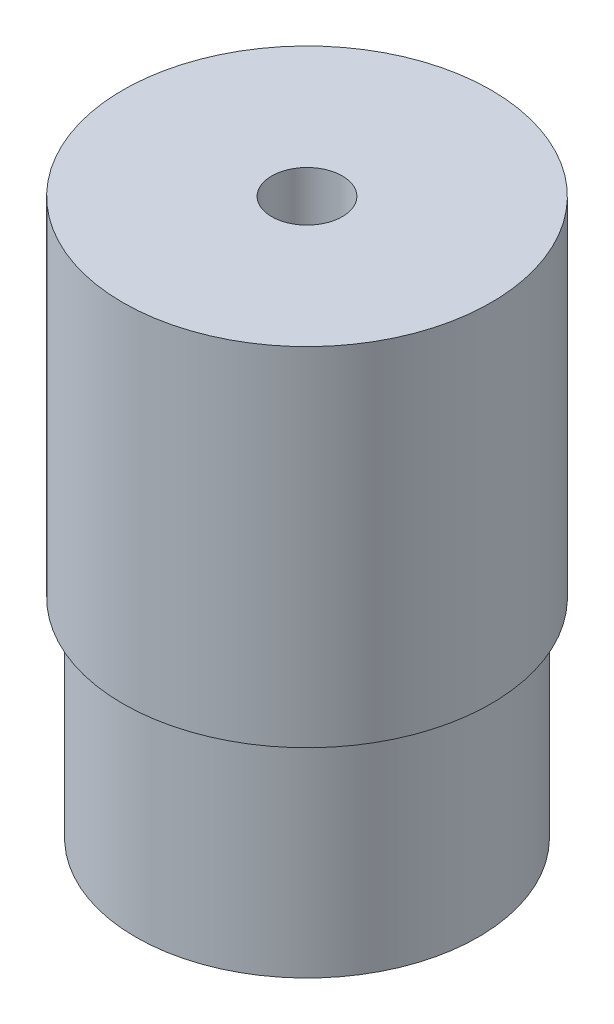
ISO-10303-21;
HEADER;
FILE_DESCRIPTION(('STEP AP214'),'2;1');
FILE_NAME('part.step','',(''),(''),'','','');
FILE_SCHEMA(('AUTOMOTIVE_DESIGN { 1 0 10303 214 1 1 1 1 }'));
ENDSEC;
DATA;
#1=APPLICATION_CONTEXT('core data for automotive mechanical design processes');
#2=APPLICATION_PROTOCOL_DEFINITION('international standard','automotive_design',2000,#1);
#3=PRODUCT_CONTEXT('',#1,'mechanical');
#4=PRODUCT('Part','Part','',(#3));
#5=PRODUCT_RELATED_PRODUCT_CATEGORY('part','',(#4));
#6=PRODUCT_DEFINITION_FORMATION('','',#4);
#7=PRODUCT_DEFINITION_CONTEXT('part definition',#1,'design');
#8=PRODUCT_DEFINITION('design','',#6,#7);
#9=PRODUCT_DEFINITION_SHAPE('','',#8);
#10=(LENGTH_UNIT() NAMED_UNIT(*) SI_UNIT(.MILLI.,.METRE.));
#11=(NAMED_UNIT(*) PLANE_ANGLE_UNIT() SI_UNIT($,.RADIAN.));
#12=(NAMED_UNIT(*) SI_UNIT($,.STERADIAN.) SOLID_ANGLE_UNIT());
#13=UNCERTAINTY_MEASURE_WITH_UNIT(LENGTH_MEASURE(1.E-05),#10,'distance_accuracy_value','');
#14=(GEOMETRIC_REPRESENTATION_CONTEXT(3) GLOBAL_UNCERTAINTY_ASSIGNED_CONTEXT((#13)) GLOBAL_UNIT_ASSIGNED_CONTEXT((#10,
#11,#12)) REPRESENTATION_CONTEXT('',''));
#15=CARTESIAN_POINT('',(0.,0.,0.));
#16=DIRECTION('',(0.,0.,1.));
#17=DIRECTION('',(1.,0.,0.));
#18=AXIS2_PLACEMENT_3D('',#15,#16,#17);
#19=CARTESIAN_POINT('',(0.,-90.95,0.));
#20=DIRECTION('',(0.,-1.,0.));
#21=DIRECTION('',(0.,0.,-1.));
#22=AXIS2_PLACEMENT_3D('',#19,#20,#21);
#23=PLANE('',#22);
#24=CARTESIAN_POINT('',(0.,-90.95,0.));
#25=DIRECTION('',(0.,1.,0.));
#26=DIRECTION('',(0.,0.,1.));
#27=AXIS2_PLACEMENT_3D('',#24,#25,#26);
#28=CIRCLE('',#27,1.525);
#29=CARTESIAN_POINT('',(0.,-90.95,1.525));
#30=VERTEX_POINT('',#29);
#31=EDGE_CURVE('E54',#30,#30,#28,.T.);
#32=ORIENTED_EDGE('',*,*,#31,.F.);
#33=EDGE_LOOP('',(#32));
#34=FACE_BOUND('',#33,.T.);
#35=CARTESIAN_POINT('',(0.,-90.95,0.));
#36=DIRECTION('',(0.,1.,0.));
#37=DIRECTION('',(0.,0.,1.));
#38=AXIS2_PLACEMENT_3D('',#35,#36,#37);
#39=CIRCLE('',#38,7.95000000000001);
#40=CARTESIAN_POINT('',(0.,-90.95,7.95000000000001));
#41=VERTEX_POINT('',#40);
#42=EDGE_CURVE('E10',#41,#41,#39,.T.);
#43=ORIENTED_EDGE('',*,*,#42,.T.);
#44=EDGE_LOOP('',(#43));
#45=FACE_BOUND('',#44,.T.);
#46=ADVANCED_FACE('F34',(#34,#45),#23,.F.);
#47=CARTESIAN_POINT('',(0.,-65.3275464649069,0.));
#48=DIRECTION('',(0.,1.,0.));
#49=DIRECTION('',(0.,0.,1.));
#50=AXIS2_PLACEMENT_3D('',#47,#48,#49);
#51=CYLINDRICAL_SURFACE('',#50,7.95000000000001);
#52=ORIENTED_EDGE('',*,*,#42,.F.);
#53=EDGE_LOOP('',(#52));
#54=FACE_BOUND('',#53,.T.);
#55=CARTESIAN_POINT('',(0.,-105.95,0.));
#56=DIRECTION('',(0.,1.,0.));
#57=DIRECTION('',(0.,0.,1.));
#58=AXIS2_PLACEMENT_3D('',#55,#56,#57);
#59=CIRCLE('',#58,7.95000000000001);
#60=CARTESIAN_POINT('',(0.,-105.95,7.95000000000001));
#61=VERTEX_POINT('',#60);
#62=EDGE_CURVE('E40',#61,#61,#59,.T.);
#63=ORIENTED_EDGE('',*,*,#62,.T.);
#64=EDGE_LOOP('',(#63));
#65=FACE_BOUND('',#64,.T.);
#66=ADVANCED_FACE('F70',(#54,#65),#51,.T.);
#67=CARTESIAN_POINT('',(7.95000000000001,-105.95,0.));
#68=DIRECTION('',(0.,1.,0.));
#69=DIRECTION('',(0.,0.,1.));
#70=AXIS2_PLACEMENT_3D('',#67,#68,#69);
#71=PLANE('',#70);
#72=ORIENTED_EDGE('',*,*,#62,.F.);
#73=EDGE_LOOP('',(#72));
#74=FACE_BOUND('',#73,.T.);
#75=CARTESIAN_POINT('',(0.,-105.95,0.));
#76=DIRECTION('',(0.,1.,0.));
#77=DIRECTION('',(0.,0.,1.));
#78=AXIS2_PLACEMENT_3D('',#75,#76,#77);
#79=CIRCLE('',#78,7.40000000000001);
#80=CARTESIAN_POINT('',(0.,-105.95,7.40000000000001));
#81=VERTEX_POINT('',#80);
#82=EDGE_CURVE('E44',#81,#81,#79,.T.);
#83=ORIENTED_EDGE('',*,*,#82,.T.);
#84=EDGE_LOOP('',(#83));
#85=FACE_BOUND('',#84,.T.);
#86=ADVANCED_FACE('F74',(#74,#85),#71,.F.);
#87=CARTESIAN_POINT('',(0.,-65.3275464649069,0.));
#88=DIRECTION('',(0.,1.,0.));
#89=DIRECTION('',(0.,0.,1.));
#90=AXIS2_PLACEMENT_3D('',#87,#88,#89);
#91=CYLINDRICAL_SURFACE('',#90,7.40000000000001);
#92=ORIENTED_EDGE('',*,*,#82,.F.);
#93=EDGE_LOOP('',(#92));
#94=FACE_BOUND('',#93,.T.);
#95=CARTESIAN_POINT('',(0.,-114.95,0.));
#96=DIRECTION('',(0.,1.,0.));
#97=DIRECTION('',(0.,0.,1.));
#98=AXIS2_PLACEMENT_3D('',#95,#96,#97);
#99=CIRCLE('',#98,7.40000000000001);
#100=CARTESIAN_POINT('',(0.,-114.95,7.40000000000001));
#101=VERTEX_POINT('',#100);
#102=EDGE_CURVE('E48',#101,#101,#99,.T.);
#103=ORIENTED_EDGE('',*,*,#102,.T.);
#104=EDGE_LOOP('',(#103));
#105=FACE_BOUND('',#104,.T.);
#106=ADVANCED_FACE('F79',(#94,#105),#91,.T.);
#107=CARTESIAN_POINT('',(7.40000000000001,-114.95,0.));
#108=DIRECTION('',(0.,1.,0.));
#109=DIRECTION('',(0.,0.,1.));
#110=AXIS2_PLACEMENT_3D('',#107,#108,#109);
#111=PLANE('',#110);
#112=CARTESIAN_POINT('',(0.,-114.95,0.));
#113=DIRECTION('',(0.,1.,0.));
#114=DIRECTION('',(0.,0.,1.));
#115=AXIS2_PLACEMENT_3D('',#112,#113,#114);
#116=CIRCLE('',#115,1.525);
#117=CARTESIAN_POINT('',(0.,-114.95,1.525));
#118=VERTEX_POINT('',#117);
#119=EDGE_CURVE('E53',#118,#118,#116,.T.);
#120=ORIENTED_EDGE('',*,*,#119,.T.);
#121=EDGE_LOOP('',(#120));
#122=FACE_BOUND('',#121,.T.);
#123=ORIENTED_EDGE('',*,*,#102,.F.);
#124=EDGE_LOOP('',(#123));
#125=FACE_BOUND('',#124,.T.);
#126=ADVANCED_FACE('F60',(#122,#125),#111,.F.);
#127=CARTESIAN_POINT('',(0.,-114.95,0.));
#128=DIRECTION('',(0.,1.,0.));
#129=DIRECTION('',(0.,0.,1.));
#130=AXIS2_PLACEMENT_3D('',#127,#128,#129);
#131=CYLINDRICAL_SURFACE('',#130,1.525);
#132=ORIENTED_EDGE('',*,*,#119,.F.);
#133=EDGE_LOOP('',(#132));
#134=FACE_BOUND('',#133,.T.);
#135=ORIENTED_EDGE('',*,*,#31,.T.);
#136=EDGE_LOOP('',(#135));
#137=FACE_BOUND('',#136,.T.);
#138=ADVANCED_FACE('F63',(#134,#137),#131,.F.);
#139=CLOSED_SHELL('',(#46,#66,#86,#106,#126,#138));
#140=MANIFOLD_SOLID_BREP('B2',#139);
#141=ADVANCED_BREP_SHAPE_REPRESENTATION('',(#18,#140),#14);
#142=SHAPE_DEFINITION_REPRESENTATION(#9,#141);
ENDSEC;
END-ISO-10303-21;
